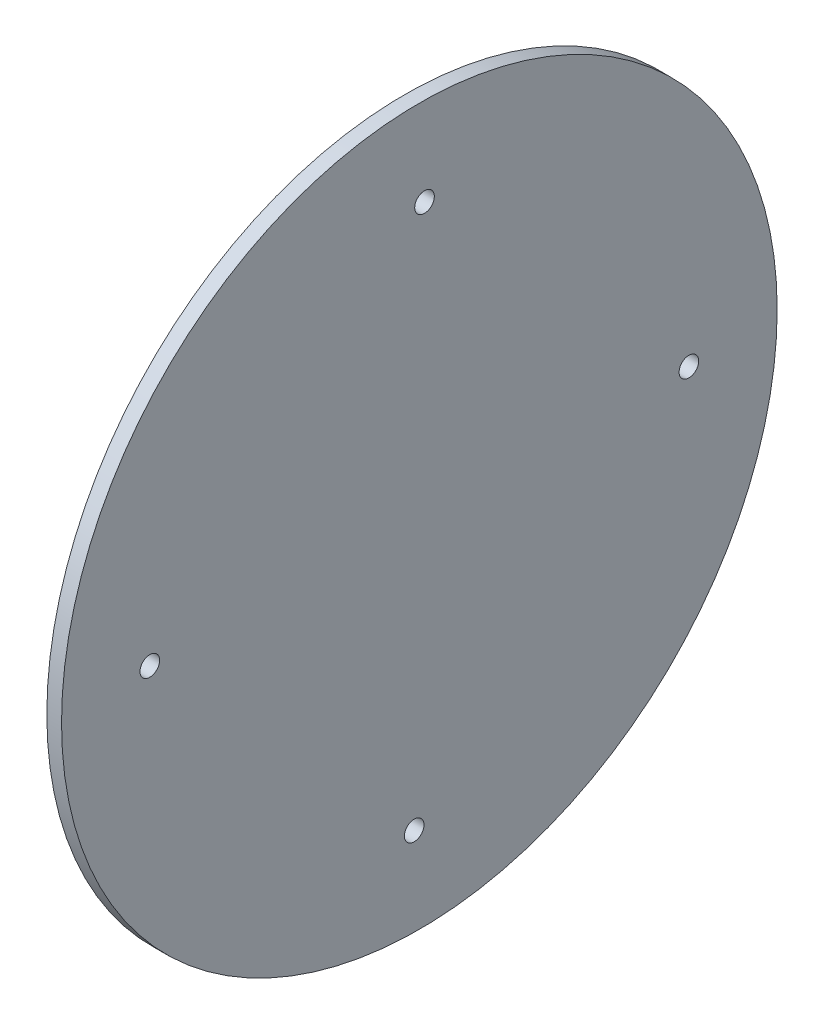
ISO-10303-21;
HEADER;
FILE_DESCRIPTION(('STEP AP214'),'2;1');
FILE_NAME('part.step','',(''),(''),'','','');
FILE_SCHEMA(('AUTOMOTIVE_DESIGN { 1 0 10303 214 1 1 1 1 }'));
ENDSEC;
DATA;
#1=APPLICATION_CONTEXT('core data for automotive mechanical design processes');
#2=APPLICATION_PROTOCOL_DEFINITION('international standard','automotive_design',2000,#1);
#3=PRODUCT_CONTEXT('',#1,'mechanical');
#4=PRODUCT('Part','Part','',(#3));
#5=PRODUCT_RELATED_PRODUCT_CATEGORY('part','',(#4));
#6=PRODUCT_DEFINITION_FORMATION('','',#4);
#7=PRODUCT_DEFINITION_CONTEXT('part definition',#1,'design');
#8=PRODUCT_DEFINITION('design','',#6,#7);
#9=PRODUCT_DEFINITION_SHAPE('','',#8);
#10=(LENGTH_UNIT() NAMED_UNIT(*) SI_UNIT(.MILLI.,.METRE.));
#11=(NAMED_UNIT(*) PLANE_ANGLE_UNIT() SI_UNIT($,.RADIAN.));
#12=(NAMED_UNIT(*) SI_UNIT($,.STERADIAN.) SOLID_ANGLE_UNIT());
#13=UNCERTAINTY_MEASURE_WITH_UNIT(LENGTH_MEASURE(1.E-05),#10,'distance_accuracy_value','');
#14=(GEOMETRIC_REPRESENTATION_CONTEXT(3) GLOBAL_UNCERTAINTY_ASSIGNED_CONTEXT((#13)) GLOBAL_UNIT_ASSIGNED_CONTEXT((#10,
#11,#12)) REPRESENTATION_CONTEXT('',''));
#15=CARTESIAN_POINT('',(0.,0.,0.));
#16=DIRECTION('',(0.,0.,1.));
#17=DIRECTION('',(1.,0.,0.));
#18=AXIS2_PLACEMENT_3D('',#15,#16,#17);
#19=CARTESIAN_POINT('',(2.,18.9571139208625,28.5428887873456));
#20=DIRECTION('',(-1.,0.,0.));
#21=DIRECTION('',(0.,0.,1.));
#22=AXIS2_PLACEMENT_3D('',#19,#20,#21);
#23=CYLINDRICAL_SURFACE('',#22,36.5);
#24=CARTESIAN_POINT('',(0.5,18.9571139208625,28.5428887873456));
#25=DIRECTION('',(1.,0.,0.));
#26=DIRECTION('',(0.,0.,-1.));
#27=AXIS2_PLACEMENT_3D('',#24,#25,#26);
#28=CIRCLE('',#27,36.5);
#29=CARTESIAN_POINT('',(0.5,18.9571139208625,-7.95711121265442));
#30=VERTEX_POINT('',#29);
#31=EDGE_CURVE('E70',#30,#30,#28,.T.);
#32=ORIENTED_EDGE('',*,*,#31,.T.);
#33=EDGE_LOOP('',(#32));
#34=FACE_BOUND('',#33,.T.);
#35=CARTESIAN_POINT('',(2.,18.9571139208625,28.5428887873456));
#36=DIRECTION('',(1.,0.,0.));
#37=DIRECTION('',(0.,0.,-1.));
#38=AXIS2_PLACEMENT_3D('',#35,#36,#37);
#39=CIRCLE('',#38,36.5);
#40=CARTESIAN_POINT('',(2.,18.9571139208625,-7.9571112126544));
#41=VERTEX_POINT('',#40);
#42=EDGE_CURVE('E10',#41,#41,#39,.T.);
#43=ORIENTED_EDGE('',*,*,#42,.F.);
#44=EDGE_LOOP('',(#43));
#45=FACE_BOUND('',#44,.T.);
#46=ADVANCED_FACE('F35',(#34,#45),#23,.T.);
#47=CARTESIAN_POINT('',(2.,18.9571139208625,28.5428887873456));
#48=DIRECTION('',(1.,0.,0.));
#49=DIRECTION('',(0.,0.,-1.));
#50=AXIS2_PLACEMENT_3D('',#47,#48,#49);
#51=PLANE('',#50);
#52=CARTESIAN_POINT('',(2.,46.4520716014477,28.0162939309088));
#53=DIRECTION('',(-1.,0.,0.));
#54=DIRECTION('',(0.,0.,1.));
#55=AXIS2_PLACEMENT_3D('',#52,#53,#54);
#56=CIRCLE('',#55,1.00000000000044);
#57=CARTESIAN_POINT('',(2.,46.4520716014477,29.0162939309092));
#58=VERTEX_POINT('',#57);
#59=EDGE_CURVE('E66',#58,#58,#56,.T.);
#60=ORIENTED_EDGE('',*,*,#59,.T.);
#61=EDGE_LOOP('',(#60));
#62=FACE_BOUND('',#61,.T.);
#63=CARTESIAN_POINT('',(2.,-8.53784375972281,29.0694836437816));
#64=DIRECTION('',(-1.,0.,0.));
#65=DIRECTION('',(0.,0.,1.));
#66=AXIS2_PLACEMENT_3D('',#63,#64,#65);
#67=CIRCLE('',#66,1.00000000000001);
#68=CARTESIAN_POINT('',(2.,-8.53784375972281,30.0694836437816));
#69=VERTEX_POINT('',#68);
#70=EDGE_CURVE('E57',#69,#69,#67,.T.);
#71=ORIENTED_EDGE('',*,*,#70,.T.);
#72=EDGE_LOOP('',(#71));
#73=FACE_BOUND('',#72,.T.);
#74=CARTESIAN_POINT('',(2.,18.4305190644262,1.04793110676035));
#75=DIRECTION('',(-1.,0.,0.));
#76=DIRECTION('',(0.,0.,1.));
#77=AXIS2_PLACEMENT_3D('',#74,#75,#76);
#78=CIRCLE('',#77,1.);
#79=CARTESIAN_POINT('',(2.,18.4305190644262,2.04793110676035));
#80=VERTEX_POINT('',#79);
#81=EDGE_CURVE('E54',#80,#80,#78,.T.);
#82=ORIENTED_EDGE('',*,*,#81,.T.);
#83=EDGE_LOOP('',(#82));
#84=FACE_BOUND('',#83,.T.);
#85=CARTESIAN_POINT('',(2.,19.4837087772986,56.0378464679308));
#86=DIRECTION('',(-1.,0.,0.));
#87=DIRECTION('',(0.,0.,1.));
#88=AXIS2_PLACEMENT_3D('',#85,#86,#87);
#89=CIRCLE('',#88,1.00000000000002);
#90=CARTESIAN_POINT('',(2.,19.4837087772986,57.0378464679308));
#91=VERTEX_POINT('',#90);
#92=EDGE_CURVE('E47',#91,#91,#89,.T.);
#93=ORIENTED_EDGE('',*,*,#92,.T.);
#94=EDGE_LOOP('',(#93));
#95=FACE_BOUND('',#94,.T.);
#96=ORIENTED_EDGE('',*,*,#42,.T.);
#97=EDGE_LOOP('',(#96));
#98=FACE_BOUND('',#97,.T.);
#99=ADVANCED_FACE('F109',(#62,#73,#84,#95,#98),#51,.T.);
#100=CARTESIAN_POINT('',(0.,18.9571139208625,28.5428887873456));
#101=DIRECTION('',(1.,0.,0.));
#102=DIRECTION('',(0.,0.,-1.));
#103=AXIS2_PLACEMENT_3D('',#100,#101,#102);
#104=PLANE('',#103);
#105=CARTESIAN_POINT('',(0.,18.9571139208625,28.5428887873456));
#106=DIRECTION('',(1.,0.,0.));
#107=DIRECTION('',(0.,0.,-1.));
#108=AXIS2_PLACEMENT_3D('',#105,#106,#107);
#109=CIRCLE('',#108,35.);
#110=CARTESIAN_POINT('',(0.,18.9571139208625,-6.45711121265442));
#111=VERTEX_POINT('',#110);
#112=EDGE_CURVE('E73',#111,#111,#109,.T.);
#113=ORIENTED_EDGE('',*,*,#112,.F.);
#114=EDGE_LOOP('',(#113));
#115=FACE_BOUND('',#114,.T.);
#116=CARTESIAN_POINT('',(0.,46.4520716014477,28.0162939309088));
#117=DIRECTION('',(1.,0.,0.));
#118=DIRECTION('',(0.,0.,-1.));
#119=AXIS2_PLACEMENT_3D('',#116,#117,#118);
#120=CIRCLE('',#119,1.00000000000044);
#121=CARTESIAN_POINT('',(0.,46.4520716014477,27.0162939309084));
#122=VERTEX_POINT('',#121);
#123=EDGE_CURVE('E38',#122,#122,#120,.T.);
#124=ORIENTED_EDGE('',*,*,#123,.T.);
#125=EDGE_LOOP('',(#124));
#126=FACE_BOUND('',#125,.T.);
#127=CARTESIAN_POINT('',(0.,-8.53784375972281,29.0694836437816));
#128=DIRECTION('',(1.,0.,0.));
#129=DIRECTION('',(0.,0.,-1.));
#130=AXIS2_PLACEMENT_3D('',#127,#128,#129);
#131=CIRCLE('',#130,1.00000000000001);
#132=CARTESIAN_POINT('',(0.,-8.53784375972281,28.0694836437816));
#133=VERTEX_POINT('',#132);
#134=EDGE_CURVE('E55',#133,#133,#131,.T.);
#135=ORIENTED_EDGE('',*,*,#134,.T.);
#136=EDGE_LOOP('',(#135));
#137=FACE_BOUND('',#136,.T.);
#138=CARTESIAN_POINT('',(0.,18.4305190644262,1.04793110676035));
#139=DIRECTION('',(1.,0.,0.));
#140=DIRECTION('',(0.,0.,-1.));
#141=AXIS2_PLACEMENT_3D('',#138,#139,#140);
#142=CIRCLE('',#141,1.);
#143=CARTESIAN_POINT('',(0.,18.4305190644262,0.0479311067603512));
#144=VERTEX_POINT('',#143);
#145=EDGE_CURVE('E52',#144,#144,#142,.T.);
#146=ORIENTED_EDGE('',*,*,#145,.T.);
#147=EDGE_LOOP('',(#146));
#148=FACE_BOUND('',#147,.T.);
#149=CARTESIAN_POINT('',(0.,19.4837087772986,56.0378464679308));
#150=DIRECTION('',(1.,0.,0.));
#151=DIRECTION('',(0.,0.,-1.));
#152=AXIS2_PLACEMENT_3D('',#149,#150,#151);
#153=CIRCLE('',#152,1.00000000000002);
#154=CARTESIAN_POINT('',(0.,19.4837087772986,55.0378464679308));
#155=VERTEX_POINT('',#154);
#156=EDGE_CURVE('E42',#155,#155,#153,.T.);
#157=ORIENTED_EDGE('',*,*,#156,.T.);
#158=EDGE_LOOP('',(#157));
#159=FACE_BOUND('',#158,.T.);
#160=ADVANCED_FACE('F113',(#115,#126,#137,#148,#159),#104,.F.);
#161=CARTESIAN_POINT('',(2.,19.4837087772986,56.0378464679308));
#162=DIRECTION('',(-1.,0.,0.));
#163=DIRECTION('',(0.,0.,1.));
#164=AXIS2_PLACEMENT_3D('',#161,#162,#163);
#165=CYLINDRICAL_SURFACE('',#164,1.00000000000002);
#166=ORIENTED_EDGE('',*,*,#92,.F.);
#167=EDGE_LOOP('',(#166));
#168=FACE_BOUND('',#167,.T.);
#169=ORIENTED_EDGE('',*,*,#156,.F.);
#170=EDGE_LOOP('',(#169));
#171=FACE_BOUND('',#170,.T.);
#172=ADVANCED_FACE('F119',(#168,#171),#165,.F.);
#173=CARTESIAN_POINT('',(2.,18.4305190644262,1.04793110676035));
#174=DIRECTION('',(-1.,0.,0.));
#175=DIRECTION('',(0.,0.,1.));
#176=AXIS2_PLACEMENT_3D('',#173,#174,#175);
#177=CYLINDRICAL_SURFACE('',#176,1.);
#178=ORIENTED_EDGE('',*,*,#81,.F.);
#179=EDGE_LOOP('',(#178));
#180=FACE_BOUND('',#179,.T.);
#181=ORIENTED_EDGE('',*,*,#145,.F.);
#182=EDGE_LOOP('',(#181));
#183=FACE_BOUND('',#182,.T.);
#184=ADVANCED_FACE('F124',(#180,#183),#177,.F.);
#185=CARTESIAN_POINT('',(2.,-8.53784375972281,29.0694836437816));
#186=DIRECTION('',(-1.,0.,0.));
#187=DIRECTION('',(0.,0.,1.));
#188=AXIS2_PLACEMENT_3D('',#185,#186,#187);
#189=CYLINDRICAL_SURFACE('',#188,1.00000000000001);
#190=ORIENTED_EDGE('',*,*,#70,.F.);
#191=EDGE_LOOP('',(#190));
#192=FACE_BOUND('',#191,.T.);
#193=ORIENTED_EDGE('',*,*,#134,.F.);
#194=EDGE_LOOP('',(#193));
#195=FACE_BOUND('',#194,.T.);
#196=ADVANCED_FACE('F128',(#192,#195),#189,.F.);
#197=CARTESIAN_POINT('',(2.,46.4520716014477,28.0162939309088));
#198=DIRECTION('',(-1.,0.,0.));
#199=DIRECTION('',(0.,0.,1.));
#200=AXIS2_PLACEMENT_3D('',#197,#198,#199);
#201=CYLINDRICAL_SURFACE('',#200,1.00000000000044);
#202=ORIENTED_EDGE('',*,*,#59,.F.);
#203=EDGE_LOOP('',(#202));
#204=FACE_BOUND('',#203,.T.);
#205=ORIENTED_EDGE('',*,*,#123,.F.);
#206=EDGE_LOOP('',(#205));
#207=FACE_BOUND('',#206,.T.);
#208=ADVANCED_FACE('F103',(#204,#207),#201,.F.);
#209=CARTESIAN_POINT('',(0.5,18.9571139208625,28.5428887873456));
#210=DIRECTION('',(1.,0.,0.));
#211=DIRECTION('',(0.,0.,-1.));
#212=AXIS2_PLACEMENT_3D('',#209,#210,#211);
#213=PLANE('',#212);
#214=CARTESIAN_POINT('',(0.5,18.9571139208625,28.5428887873456));
#215=DIRECTION('',(-1.,0.,0.));
#216=DIRECTION('',(0.,0.,1.));
#217=AXIS2_PLACEMENT_3D('',#214,#215,#216);
#218=CIRCLE('',#217,35.5);
#219=CARTESIAN_POINT('',(0.5,18.9571139208625,64.0428887873456));
#220=VERTEX_POINT('',#219);
#221=EDGE_CURVE('E77',#220,#220,#218,.T.);
#222=ORIENTED_EDGE('',*,*,#221,.F.);
#223=EDGE_LOOP('',(#222));
#224=FACE_BOUND('',#223,.T.);
#225=ORIENTED_EDGE('',*,*,#31,.F.);
#226=EDGE_LOOP('',(#225));
#227=FACE_BOUND('',#226,.T.);
#228=ADVANCED_FACE('F100',(#224,#227),#213,.F.);
#229=CARTESIAN_POINT('',(0.5,18.9571139208625,28.5428887873456));
#230=DIRECTION('',(-1.,0.,0.));
#231=DIRECTION('',(0.,0.,1.));
#232=AXIS2_PLACEMENT_3D('',#229,#230,#231);
#233=CYLINDRICAL_SURFACE('',#232,35.);
#234=ORIENTED_EDGE('',*,*,#112,.T.);
#235=EDGE_LOOP('',(#234));
#236=FACE_BOUND('',#235,.T.);
#237=CARTESIAN_POINT('',(0.75,18.9571139208625,28.5428887873456));
#238=DIRECTION('',(-1.,0.,0.));
#239=DIRECTION('',(0.,0.,1.));
#240=AXIS2_PLACEMENT_3D('',#237,#238,#239);
#241=CIRCLE('',#240,35.);
#242=CARTESIAN_POINT('',(0.75,18.9571139208625,63.5428887873456));
#243=VERTEX_POINT('',#242);
#244=EDGE_CURVE('E80',#243,#243,#241,.T.);
#245=ORIENTED_EDGE('',*,*,#244,.T.);
#246=EDGE_LOOP('',(#245));
#247=FACE_BOUND('',#246,.T.);
#248=ADVANCED_FACE('F86',(#236,#247),#233,.T.);
#249=CARTESIAN_POINT('',(0.75,18.9571139208625,28.5428887873456));
#250=DIRECTION('',(-1.,0.,0.));
#251=DIRECTION('',(0.,0.,1.));
#252=AXIS2_PLACEMENT_3D('',#249,#250,#251);
#253=CYLINDRICAL_SURFACE('',#252,35.5);
#254=CARTESIAN_POINT('',(0.75,18.9571139208625,28.5428887873456));
#255=DIRECTION('',(-1.,0.,0.));
#256=DIRECTION('',(0.,0.,1.));
#257=AXIS2_PLACEMENT_3D('',#254,#255,#256);
#258=CIRCLE('',#257,35.5);
#259=CARTESIAN_POINT('',(0.75,18.9571139208625,64.0428887873456));
#260=VERTEX_POINT('',#259);
#261=EDGE_CURVE('E76',#260,#260,#258,.T.);
#262=ORIENTED_EDGE('',*,*,#261,.F.);
#263=EDGE_LOOP('',(#262));
#264=FACE_BOUND('',#263,.T.);
#265=ORIENTED_EDGE('',*,*,#221,.T.);
#266=EDGE_LOOP('',(#265));
#267=FACE_BOUND('',#266,.T.);
#268=ADVANCED_FACE('F91',(#264,#267),#253,.F.);
#269=CARTESIAN_POINT('',(0.75,18.9571139208625,28.5428887873456));
#270=DIRECTION('',(-1.,0.,0.));
#271=DIRECTION('',(0.,0.,1.));
#272=AXIS2_PLACEMENT_3D('',#269,#270,#271);
#273=PLANE('',#272);
#274=ORIENTED_EDGE('',*,*,#244,.F.);
#275=EDGE_LOOP('',(#274));
#276=FACE_BOUND('',#275,.T.);
#277=ORIENTED_EDGE('',*,*,#261,.T.);
#278=EDGE_LOOP('',(#277));
#279=FACE_BOUND('',#278,.T.);
#280=ADVANCED_FACE('F88',(#276,#279),#273,.T.);
#281=CLOSED_SHELL('',(#46,#99,#160,#172,#184,#196,#208,#228,#248,#268,#280));
#282=MANIFOLD_SOLID_BREP('B2',#281);
#283=ADVANCED_BREP_SHAPE_REPRESENTATION('',(#18,#282),#14);
#284=SHAPE_DEFINITION_REPRESENTATION(#9,#283);
ENDSEC;
END-ISO-10303-21;
